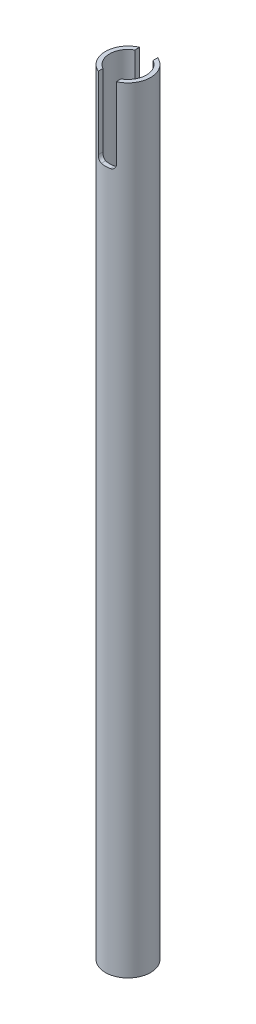
ISO-10303-21;
HEADER;
FILE_DESCRIPTION(('STEP AP214'),'2;1');
FILE_NAME('part.step','',(''),(''),'','','');
FILE_SCHEMA(('AUTOMOTIVE_DESIGN { 1 0 10303 214 1 1 1 1 }'));
ENDSEC;
DATA;
#1=APPLICATION_CONTEXT('core data for automotive mechanical design processes');
#2=APPLICATION_PROTOCOL_DEFINITION('international standard','automotive_design',2000,#1);
#3=PRODUCT_CONTEXT('',#1,'mechanical');
#4=PRODUCT('Part','Part','',(#3));
#5=PRODUCT_RELATED_PRODUCT_CATEGORY('part','',(#4));
#6=PRODUCT_DEFINITION_FORMATION('','',#4);
#7=PRODUCT_DEFINITION_CONTEXT('part definition',#1,'design');
#8=PRODUCT_DEFINITION('design','',#6,#7);
#9=PRODUCT_DEFINITION_SHAPE('','',#8);
#10=(LENGTH_UNIT() NAMED_UNIT(*) SI_UNIT(.MILLI.,.METRE.));
#11=(NAMED_UNIT(*) PLANE_ANGLE_UNIT() SI_UNIT($,.RADIAN.));
#12=(NAMED_UNIT(*) SI_UNIT($,.STERADIAN.) SOLID_ANGLE_UNIT());
#13=UNCERTAINTY_MEASURE_WITH_UNIT(LENGTH_MEASURE(1.E-05),#10,'distance_accuracy_value','');
#14=(GEOMETRIC_REPRESENTATION_CONTEXT(3) GLOBAL_UNCERTAINTY_ASSIGNED_CONTEXT((#13)) GLOBAL_UNIT_ASSIGNED_CONTEXT((#10,
#11,#12)) REPRESENTATION_CONTEXT('',''));
#15=CARTESIAN_POINT('',(0.,0.,0.));
#16=DIRECTION('',(0.,0.,1.));
#17=DIRECTION('',(1.,0.,0.));
#18=AXIS2_PLACEMENT_3D('',#15,#16,#17);
#19=CARTESIAN_POINT('',(4.7625,141.622450142195,0.));
#20=DIRECTION('',(0.,-1.,0.));
#21=DIRECTION('',(0.,0.,1.));
#22=AXIS2_PLACEMENT_3D('',#19,#20,#21);
#23=PLANE('',#22);
#24=DIRECTION('',(0.,0.,-1.));
#25=VECTOR('',#24,1.);
#26=CARTESIAN_POINT('',(3.17499999999998,141.622450142196,7.93750000000011));
#27=LINE('',#26,#25);
#28=CARTESIAN_POINT('',(3.17499999999998,141.622450142196,7.2748389157424));
#29=VERTEX_POINT('',#28);
#30=CARTESIAN_POINT('',(3.17499999999998,141.622450142196,5.63085690548074));
#31=VERTEX_POINT('',#30);
#32=EDGE_CURVE('E263',#29,#31,#27,.T.);
#33=ORIENTED_EDGE('',*,*,#32,.F.);
#34=CARTESIAN_POINT('',(0.,141.622450142195,0.));
#35=DIRECTION('',(0.,-1.,0.));
#36=DIRECTION('',(0.,0.,-1.));
#37=AXIS2_PLACEMENT_3D('',#34,#35,#36);
#38=CIRCLE('',#37,7.9375);
#39=CARTESIAN_POINT('',(3.17499999999998,141.622450142196,-7.2748389157424));
#40=VERTEX_POINT('',#39);
#41=EDGE_CURVE('E283',#40,#29,#38,.T.);
#42=ORIENTED_EDGE('',*,*,#41,.F.);
#43=CARTESIAN_POINT('',(3.17499999999998,141.622450142196,-5.63085690548074));
#44=VERTEX_POINT('',#43);
#45=EDGE_CURVE('E261',#44,#40,#27,.T.);
#46=ORIENTED_EDGE('',*,*,#45,.F.);
#47=CARTESIAN_POINT('',(0.,141.622450142195,0.));
#48=DIRECTION('',(0.,-1.,0.));
#49=DIRECTION('',(0.,0.,-1.));
#50=AXIS2_PLACEMENT_3D('',#47,#48,#49);
#51=CIRCLE('',#50,6.4643);
#52=EDGE_CURVE('E284',#44,#31,#51,.T.);
#53=ORIENTED_EDGE('',*,*,#52,.T.);
#54=EDGE_LOOP('',(#33,#42,#46,#53));
#55=FACE_BOUND('',#54,.T.);
#56=ADVANCED_FACE('F33',(#55),#23,.F.);
#57=DIRECTION('',(0.,0.,-1.));
#58=VECTOR('',#57,1.);
#59=CARTESIAN_POINT('',(-3.17499999999998,141.622450142196,7.93750000000011));
#60=LINE('',#59,#58);
#61=CARTESIAN_POINT('',(-3.17499999999998,141.622450142196,-5.63085690548088));
#62=VERTEX_POINT('',#61);
#63=CARTESIAN_POINT('',(-3.17499999999998,141.622450142196,-7.27483891574251));
#64=VERTEX_POINT('',#63);
#65=EDGE_CURVE('E257',#62,#64,#60,.T.);
#66=ORIENTED_EDGE('',*,*,#65,.T.);
#67=CARTESIAN_POINT('',(-3.17499999999998,141.622450142196,7.27483891574251));
#68=VERTEX_POINT('',#67);
#69=EDGE_CURVE('E278',#68,#64,#38,.T.);
#70=ORIENTED_EDGE('',*,*,#69,.F.);
#71=CARTESIAN_POINT('',(-3.17499999999998,141.622450142196,5.63085690548088));
#72=VERTEX_POINT('',#71);
#73=EDGE_CURVE('E260',#68,#72,#60,.T.);
#74=ORIENTED_EDGE('',*,*,#73,.T.);
#75=EDGE_CURVE('E285',#72,#62,#51,.T.);
#76=ORIENTED_EDGE('',*,*,#75,.T.);
#77=EDGE_LOOP('',(#66,#70,#74,#76));
#78=FACE_BOUND('',#77,.T.);
#79=ADVANCED_FACE('F190',(#78),#23,.F.);
#80=CARTESIAN_POINT('',(0.,25.4,0.));
#81=DIRECTION('',(0.,-1.,0.));
#82=DIRECTION('',(0.,0.,-1.));
#83=AXIS2_PLACEMENT_3D('',#80,#81,#82);
#84=CYLINDRICAL_SURFACE('',#83,6.4643);
#85=CARTESIAN_POINT('',(0.,-130.686769936123,1.09700443173821E-13));
#86=DIRECTION('',(0.,1.,0.));
#87=DIRECTION('',(0.,0.,1.));
#88=AXIS2_PLACEMENT_3D('',#85,#86,#87);
#89=CIRCLE('',#88,6.4643);
#90=CARTESIAN_POINT('',(0.,-130.686769936123,6.46430000000011));
#91=VERTEX_POINT('',#90);
#92=EDGE_CURVE('E272',#91,#91,#89,.T.);
#93=ORIENTED_EDGE('',*,*,#92,.F.);
#94=EDGE_LOOP('',(#93));
#95=FACE_BOUND('',#94,.T.);
#96=ORIENTED_EDGE('',*,*,#52,.F.);
#97=DIRECTION('',(0.,-1.,0.));
#98=VECTOR('',#97,1.);
#99=CARTESIAN_POINT('',(3.17500000000024,25.4,-5.63085690548059));
#100=LINE('',#99,#98);
#101=CARTESIAN_POINT('',(3.17500000000004,116.222450142196,-5.63085690548059));
#102=VERTEX_POINT('',#101);
#103=EDGE_CURVE('E180',#44,#102,#100,.T.);
#104=ORIENTED_EDGE('',*,*,#103,.T.);
#105=CARTESIAN_POINT('',(3.17500000000007,116.222450142196,-5.63085690548069));
#106=CARTESIAN_POINT('',(3.17500265942438,116.18129331152,-5.63085243150935));
#107=CARTESIAN_POINT('',(3.17339835018613,116.140158789346,-5.63176028239593));
#108=CARTESIAN_POINT('',(3.16701766507693,116.058232974005,-5.63535215701946));
#109=CARTESIAN_POINT('',(3.16224273305137,116.017441533164,-5.638035372285));
#110=CARTESIAN_POINT('',(3.143296645079,115.896446306391,-5.64863522411119));
#111=CARTESIAN_POINT('',(3.12450305374461,115.81713425395,-5.65910325483869));
#112=CARTESIAN_POINT('',(3.07549165040556,115.663384359452,-5.68588522764514));
#113=CARTESIAN_POINT('',(3.04528974537466,115.588939899132,-5.70219102829137));
#114=CARTESIAN_POINT('',(2.97460119282062,115.446272278136,-5.73938277272114));
#115=CARTESIAN_POINT('',(2.93410271969427,115.378056394245,-5.7602739790437));
#116=CARTESIAN_POINT('',(2.84103773378427,115.244778425985,-5.80676804025644));
#117=CARTESIAN_POINT('',(2.78784532739577,115.180232263922,-5.83259254506419));
#118=CARTESIAN_POINT('',(2.67254263369965,115.060665553884,-5.88631786935966));
#119=CARTESIAN_POINT('',(2.61042818908357,115.005649473051,-5.91421965383981));
#120=CARTESIAN_POINT('',(2.4714337140954,114.900632624744,-5.97373371686977));
#121=CARTESIAN_POINT('',(2.39368295701586,114.851822205188,-6.00542032126395));
#122=CARTESIAN_POINT('',(2.23068225215684,114.768194807137,-6.06785364975218));
#123=CARTESIAN_POINT('',(2.14543609512394,114.733370804165,-6.09860083846705));
#124=CARTESIAN_POINT('',(1.98216120584028,114.682773530532,-6.15341243852266));
#125=CARTESIAN_POINT('',(1.90486553835034,114.664976619597,-6.177801004364));
#126=CARTESIAN_POINT('',(1.74771289593301,114.641047451788,-6.224108887545));
#127=CARTESIAN_POINT('',(1.66785396509188,114.634924328704,-6.24602625877207));
#128=CARTESIAN_POINT('',(1.58750000000018,114.634950142196,-6.26634009929236));
#129=B_SPLINE_CURVE_WITH_KNOTS('',3,(#105,#106,#107,#108,#109,#110,#111,#112,#113,#114,#115,
#116,#117,#118,#119,#120,#121,#122,#123,#124,#125,#126,#127,#128),.UNSPECIFIED.,.F.,.F.,(4,2,2,
2,2,2,2,2,2,2,2,4),(0.,0.123386261727179,0.246716374037833,0.49193498010571,0.736812924701871,
0.981973392060187,1.24352761602781,1.50520411142382,1.79524970866356,2.08514945193381,
2.33322496948237,2.58149450643048),.UNSPECIFIED.);
#130=CARTESIAN_POINT('',(1.58750000000019,114.634950142196,-6.26634009929236));
#131=VERTEX_POINT('',#130);
#132=EDGE_CURVE('E173',#102,#131,#129,.T.);
#133=ORIENTED_EDGE('',*,*,#132,.T.);
#134=CARTESIAN_POINT('',(0.,114.634950142196,0.));
#135=DIRECTION('',(0.,1.,0.));
#136=DIRECTION('',(0.,0.,1.));
#137=AXIS2_PLACEMENT_3D('',#134,#135,#136);
#138=CIRCLE('',#137,6.4643);
#139=CARTESIAN_POINT('',(-1.58749999999991,114.634950142196,-6.26634009929243));
#140=VERTEX_POINT('',#139);
#141=EDGE_CURVE('E250',#131,#140,#138,.T.);
#142=ORIENTED_EDGE('',*,*,#141,.T.);
#143=CARTESIAN_POINT('',(-1.58749999999991,114.634950142196,-6.26634009929243));
#144=CARTESIAN_POINT('',(-1.6341890068027,114.634950363611,-6.25451519937796));
#145=CARTESIAN_POINT('',(-1.68071621150082,114.637010656151,-6.24216902424752));
#146=CARTESIAN_POINT('',(-1.77313930969805,114.645159067835,-6.21654599792509));
#147=CARTESIAN_POINT('',(-1.81903543834428,114.651245642802,-6.20326950527713));
#148=CARTESIAN_POINT('',(-1.95507469082064,114.67535656655,-6.1622868398915));
#149=CARTESIAN_POINT('',(-2.0438753420167,114.699233385489,-6.133349352247));
#150=CARTESIAN_POINT('',(-2.21532061503974,114.761518091836,-6.0735318101998));
#151=CARTESIAN_POINT('',(-2.29797173444347,114.799910373617,-6.04265387160466));
#152=CARTESIAN_POINT('',(-2.45546303738956,114.890145327512,-5.98038883139866));
#153=CARTESIAN_POINT('',(-2.53029702370288,114.941998559332,-5.94900134826915));
#154=CARTESIAN_POINT('',(-2.67287075398227,115.060122276205,-5.88635884745837));
#155=CARTESIAN_POINT('',(-2.74025626996517,115.126846161844,-5.85514963173662));
#156=CARTESIAN_POINT('',(-2.86271368076043,115.272183423216,-5.796263402366));
#157=CARTESIAN_POINT('',(-2.91778558227079,115.350796792481,-5.7685863867958));
#158=CARTESIAN_POINT('',(-3.01168872656624,115.515018726726,-5.72010524984435));
#159=CARTESIAN_POINT('',(-3.0510450221677,115.600261330066,-5.69908490291322));
#160=CARTESIAN_POINT('',(-3.1143037346524,115.777662124546,-5.66476886814874));
#161=CARTESIAN_POINT('',(-3.13824572360371,115.869801923889,-5.65145340907633));
#162=CARTESIAN_POINT('',(-3.16081362599342,116.006294931763,-5.63883740321029));
#163=CARTESIAN_POINT('',(-3.16612512648611,116.04930367883,-5.63585394797717));
#164=CARTESIAN_POINT('',(-3.17321828948626,116.135681719434,-5.6318620149314));
#165=CARTESIAN_POINT('',(-3.17500157254305,116.179050838253,-5.63085263040867));
#166=CARTESIAN_POINT('',(-3.17499999999996,116.222450142196,-5.63085690548075));
#167=B_SPLINE_CURVE_WITH_KNOTS('',3,(#143,#144,#145,#146,#147,#148,#149,#150,#151,#152,#153,
#154,#155,#156,#157,#158,#159,#160,#161,#162,#163,#164,#165,#166),.UNSPECIFIED.,.F.,.F.,(4,2,2,
2,2,2,2,2,2,2,2,4),(0.,0.144388740940304,0.288722137366161,0.57645212892239,0.863873656489916,
1.15152134248764,1.44956694911568,1.74761239362147,2.03464137858761,2.32093052452351,
2.45108160789042,2.58117289753282),.UNSPECIFIED.);
#168=CARTESIAN_POINT('',(-3.17499999999993,116.222450142196,-5.63085690548077));
#169=VERTEX_POINT('',#168);
#170=EDGE_CURVE('E195',#140,#169,#167,.T.);
#171=ORIENTED_EDGE('',*,*,#170,.T.);
#172=DIRECTION('',(0.,-1.,0.));
#173=VECTOR('',#172,1.);
#174=CARTESIAN_POINT('',(-3.17499999999973,25.4,-5.63085690548088));
#175=LINE('',#174,#173);
#176=EDGE_CURVE('E211',#169,#62,#175,.F.);
#177=ORIENTED_EDGE('',*,*,#176,.T.);
#178=ORIENTED_EDGE('',*,*,#75,.F.);
#179=DIRECTION('',(0.,-1.,0.));
#180=VECTOR('',#179,1.);
#181=CARTESIAN_POINT('',(-3.17499999999973,25.4,5.63085690548088));
#182=LINE('',#181,#180);
#183=CARTESIAN_POINT('',(-3.17499999999993,116.222450142196,5.63085690548077));
#184=VERTEX_POINT('',#183);
#185=EDGE_CURVE('E299',#72,#184,#182,.T.);
#186=ORIENTED_EDGE('',*,*,#185,.T.);
#187=CARTESIAN_POINT('',(-3.17499999999996,116.222450142196,5.63085690548075));
#188=CARTESIAN_POINT('',(-3.17500265942427,116.18129331152,5.63085243150942));
#189=CARTESIAN_POINT('',(-3.17339835018602,116.140158789346,5.63176028239599));
#190=CARTESIAN_POINT('',(-3.16701766507682,116.058232974005,5.63535215701953));
#191=CARTESIAN_POINT('',(-3.16224273305126,116.017441533164,5.63803537228507));
#192=CARTESIAN_POINT('',(-3.14329664507889,115.896446306391,5.64863522411125));
#193=CARTESIAN_POINT('',(-3.1245030537445,115.81713425395,5.65910325483875));
#194=CARTESIAN_POINT('',(-3.07549165040545,115.663384359452,5.6858852276452));
#195=CARTESIAN_POINT('',(-3.04528974537455,115.588939899132,5.70219102829143));
#196=CARTESIAN_POINT('',(-2.9746011928205,115.446272278136,5.7393827727212));
#197=CARTESIAN_POINT('',(-2.93410271969415,115.378056394245,5.76027397904376));
#198=CARTESIAN_POINT('',(-2.84103773378415,115.244778425985,5.80676804025649));
#199=CARTESIAN_POINT('',(-2.78784532739566,115.180232263922,5.83259254506425));
#200=CARTESIAN_POINT('',(-2.67254263369954,115.060665553884,5.88631786935971));
#201=CARTESIAN_POINT('',(-2.61042818908345,115.005649473051,5.91421965383986));
#202=CARTESIAN_POINT('',(-2.47143371409528,114.900632624744,5.97373371686981));
#203=CARTESIAN_POINT('',(-2.39368295701574,114.851822205188,6.00542032126399));
#204=CARTESIAN_POINT('',(-2.23068225215672,114.768194807137,6.06785364975222));
#205=CARTESIAN_POINT('',(-2.14543609512382,114.733370804165,6.09860083846709));
#206=CARTESIAN_POINT('',(-1.98216120584014,114.682773530532,6.15341243852271));
#207=CARTESIAN_POINT('',(-1.90486553835017,114.664976619597,6.17780100436405));
#208=CARTESIAN_POINT('',(-1.74771289593279,114.641047451788,6.22410888754506));
#209=CARTESIAN_POINT('',(-1.66785396509163,114.634924328704,6.24602625877214));
#210=CARTESIAN_POINT('',(-1.58749999999991,114.634950142196,6.26634009929243));
#211=B_SPLINE_CURVE_WITH_KNOTS('',3,(#187,#188,#189,#190,#191,#192,#193,#194,#195,#196,#197,
#198,#199,#200,#201,#202,#203,#204,#205,#206,#207,#208,#209,#210),.UNSPECIFIED.,.F.,.F.,(4,2,2,
2,2,2,2,2,2,2,2,4),(0.,0.123386261727179,0.246716374037833,0.49193498010571,0.73681292470187,
0.981973392060203,1.24352761602782,1.50520411142382,1.79524970866355,2.0851494519338,
2.33322496948244,2.58149450643064),.UNSPECIFIED.);
#212=CARTESIAN_POINT('',(-1.58749999999991,114.634950142196,6.26634009929243));
#213=VERTEX_POINT('',#212);
#214=EDGE_CURVE('E204',#184,#213,#211,.T.);
#215=ORIENTED_EDGE('',*,*,#214,.T.);
#216=CARTESIAN_POINT('',(1.58750000000019,114.634950142196,6.26634009929236));
#217=VERTEX_POINT('',#216);
#218=EDGE_CURVE('E265',#213,#217,#138,.T.);
#219=ORIENTED_EDGE('',*,*,#218,.T.);
#220=CARTESIAN_POINT('',(1.58750000000019,114.634950142196,6.26634009929236));
#221=CARTESIAN_POINT('',(1.63418900680297,114.634950363611,6.25451519937789));
#222=CARTESIAN_POINT('',(1.6807162115011,114.637010656151,6.24216902424745));
#223=CARTESIAN_POINT('',(1.77313930969832,114.645159067835,6.21654599792501));
#224=CARTESIAN_POINT('',(1.81903543834456,114.651245642802,6.20326950527705));
#225=CARTESIAN_POINT('',(1.95507469082092,114.67535656655,6.16228683989141));
#226=CARTESIAN_POINT('',(2.04387534201697,114.699233385489,6.13334935224691));
#227=CARTESIAN_POINT('',(2.21532061504001,114.761518091836,6.0735318101997));
#228=CARTESIAN_POINT('',(2.29797173444374,114.799910373617,6.04265387160456));
#229=CARTESIAN_POINT('',(2.45546303738983,114.890145327512,5.98038883139855));
#230=CARTESIAN_POINT('',(2.53029702370314,114.941998559332,5.94900134826904));
#231=CARTESIAN_POINT('',(2.67287075398251,115.060122276205,5.88635884745826));
#232=CARTESIAN_POINT('',(2.7402562699654,115.126846161844,5.85514963173651));
#233=CARTESIAN_POINT('',(2.86271368076065,115.272183423216,5.79626340236589));
#234=CARTESIAN_POINT('',(2.917785582271,115.350796792481,5.76858638679569));
#235=CARTESIAN_POINT('',(3.01168872656643,115.515018726727,5.72010524984425));
#236=CARTESIAN_POINT('',(3.05104502216788,115.600261330067,5.69908490291312));
#237=CARTESIAN_POINT('',(3.11430373465256,115.777662124546,5.66476886814865));
#238=CARTESIAN_POINT('',(3.13824572360386,115.869801923889,5.65145340907624));
#239=CARTESIAN_POINT('',(3.16081362599355,116.006294931764,5.63883740321022));
#240=CARTESIAN_POINT('',(3.16612512648623,116.04930367883,5.6358539479771));
#241=CARTESIAN_POINT('',(3.17321828948637,116.135681719434,5.63186201493133));
#242=CARTESIAN_POINT('',(3.17500157254316,116.179050838253,5.63085263040861));
#243=CARTESIAN_POINT('',(3.17500000000007,116.222450142196,5.63085690548069));
#244=B_SPLINE_CURVE_WITH_KNOTS('',3,(#220,#221,#222,#223,#224,#225,#226,#227,#228,#229,#230,
#231,#232,#233,#234,#235,#236,#237,#238,#239,#240,#241,#242,#243),.UNSPECIFIED.,.F.,.F.,(4,2,2,
2,2,2,2,2,2,2,2,4),(0.,0.144388740940308,0.288722137366167,0.576452128922401,0.863873656489942,
1.15152134248767,1.4495669491157,1.7476123936215,2.03464137858764,2.32093052452353,
2.45108160789035,2.58117289753265),.UNSPECIFIED.);
#245=CARTESIAN_POINT('',(3.17500000000004,116.222450142196,5.63085690548059));
#246=VERTEX_POINT('',#245);
#247=EDGE_CURVE('E139',#217,#246,#244,.T.);
#248=ORIENTED_EDGE('',*,*,#247,.T.);
#249=DIRECTION('',(0.,-1.,0.));
#250=VECTOR('',#249,1.);
#251=CARTESIAN_POINT('',(3.17500000000024,25.4,5.63085690548059));
#252=LINE('',#251,#250);
#253=EDGE_CURVE('E270',#246,#31,#252,.F.);
#254=ORIENTED_EDGE('',*,*,#253,.T.);
#255=EDGE_LOOP('',(#96,#104,#133,#142,#171,#177,#178,#186,#215,#219,#248,#254));
#256=FACE_BOUND('',#255,.T.);
#257=ADVANCED_FACE('F187',(#95,#256),#84,.F.);
#258=CARTESIAN_POINT('',(0.,25.4,0.));
#259=DIRECTION('',(0.,-1.,0.));
#260=DIRECTION('',(0.,0.,-1.));
#261=AXIS2_PLACEMENT_3D('',#258,#259,#260);
#262=CYLINDRICAL_SURFACE('',#261,7.9375);
#263=CARTESIAN_POINT('',(0.,-130.686769936123,1.09700443173821E-13));
#264=DIRECTION('',(0.,1.,0.));
#265=DIRECTION('',(0.,0.,1.));
#266=AXIS2_PLACEMENT_3D('',#263,#264,#265);
#267=CIRCLE('',#266,7.9375);
#268=CARTESIAN_POINT('',(0.,-130.686769936123,7.93750000000011));
#269=VERTEX_POINT('',#268);
#270=EDGE_CURVE('E274',#269,#269,#267,.T.);
#271=ORIENTED_EDGE('',*,*,#270,.T.);
#272=EDGE_LOOP('',(#271));
#273=FACE_BOUND('',#272,.T.);
#274=DIRECTION('',(0.,-1.,0.));
#275=VECTOR('',#274,1.);
#276=CARTESIAN_POINT('',(3.17500000000024,25.4,7.27483891574229));
#277=LINE('',#276,#275);
#278=CARTESIAN_POINT('',(3.17500000000004,116.222450142196,7.27483891574229));
#279=VERTEX_POINT('',#278);
#280=EDGE_CURVE('E12',#279,#29,#277,.F.);
#281=ORIENTED_EDGE('',*,*,#280,.F.);
#282=CARTESIAN_POINT('',(1.58750000000019,114.634950142196,7.77712993333655));
#283=CARTESIAN_POINT('',(1.63350676862791,114.634950385786,7.76774126330061));
#284=CARTESIAN_POINT('',(1.67940359564195,114.636951046903,7.75794444810857));
#285=CARTESIAN_POINT('',(1.7706803958093,114.644888410221,7.7376208999197));
#286=CARTESIAN_POINT('',(1.81606050148723,114.65082407897,7.72709435922083));
#287=CARTESIAN_POINT('',(1.95078228156852,114.674397028221,7.69459845201105));
#288=CARTESIAN_POINT('',(2.03894812030842,114.697800975143,7.67166299368624));
#289=CARTESIAN_POINT('',(2.20953807004396,114.759081172315,7.62428385726788));
#290=CARTESIAN_POINT('',(2.29196515383534,114.796949862574,7.59984097261632));
#291=CARTESIAN_POINT('',(2.44917385980124,114.886097132616,7.550645021841));
#292=CARTESIAN_POINT('',(2.52395227814518,114.937381300061,7.52589183057158));
#293=CARTESIAN_POINT('',(2.66543932718712,115.053368348016,7.47696931777056));
#294=CARTESIAN_POINT('',(2.7319388349313,115.118337073132,7.45282414598353));
#295=CARTESIAN_POINT('',(2.85299322074877,115.259475286965,7.40732925012115));
#296=CARTESIAN_POINT('',(2.90754767783208,115.335645170297,7.38597962458236));
#297=CARTESIAN_POINT('',(3.00159155783969,115.49521887078,7.34825600672409));
#298=CARTESIAN_POINT('',(3.04142452291165,115.578393326041,7.33177064627849));
#299=CARTESIAN_POINT('',(3.10622330269338,115.751163958141,7.30455577634138));
#300=CARTESIAN_POINT('',(3.13121458917055,115.84074883531,7.29381640854945));
#301=CARTESIAN_POINT('',(3.15710194076309,115.979796655077,7.28263004031738));
#302=CARTESIAN_POINT('',(3.16380495831036,116.028051881918,7.27971714426161));
#303=CARTESIAN_POINT('',(3.17275416759991,116.125011300347,7.27581937849737));
#304=CARTESIAN_POINT('',(3.17500392571323,116.173715101265,7.27483296598244));
#305=CARTESIAN_POINT('',(3.17500000000007,116.222450142196,7.27483891574237));
#306=B_SPLINE_CURVE_WITH_KNOTS('',3,(#282,#283,#284,#285,#286,#287,#288,#289,#290,#291,#292,
#293,#294,#295,#296,#297,#298,#299,#300,#301,#302,#303,#304,#305),.UNSPECIFIED.,.F.,.F.,(4,2,2,
2,2,2,2,2,2,2,2,4),(0.,0.140770845296611,0.281504734514017,0.562238948643056,0.842826637517807,
1.1235313801953,1.41029752992667,1.69707378478456,1.97665708187313,2.25575915194307,
2.40195937855941,2.54804247399287),.UNSPECIFIED.);
#307=CARTESIAN_POINT('',(1.58750000000019,114.634950142196,7.77712993333655));
#308=VERTEX_POINT('',#307);
#309=EDGE_CURVE('E42',#308,#279,#306,.T.);
#310=ORIENTED_EDGE('',*,*,#309,.F.);
#311=CARTESIAN_POINT('',(0.,114.634950142196,0.));
#312=DIRECTION('',(0.,1.,0.));
#313=DIRECTION('',(0.,0.,1.));
#314=AXIS2_PLACEMENT_3D('',#311,#312,#313);
#315=CIRCLE('',#314,7.9375);
#316=CARTESIAN_POINT('',(-1.58749999999991,114.634950142196,7.77712993333661));
#317=VERTEX_POINT('',#316);
#318=EDGE_CURVE('E122',#317,#308,#315,.T.);
#319=ORIENTED_EDGE('',*,*,#318,.F.);
#320=CARTESIAN_POINT('',(-3.17499999999996,116.222450142196,7.27483891574242));
#321=CARTESIAN_POINT('',(-3.17500168113654,116.180078590213,7.274835863661));
#322=CARTESIAN_POINT('',(-3.17330245165564,116.13772889455,7.27558001702577));
#323=CARTESIAN_POINT('',(-3.16653661877874,116.05336308008,7.27852818539401));
#324=CARTESIAN_POINT('',(-3.16147102917754,116.011346864699,7.28073176088513));
#325=CARTESIAN_POINT('',(-3.14133450163405,115.886564506684,7.28945465778903));
#326=CARTESIAN_POINT('',(-3.1213230875001,115.804684187594,7.29808678684579));
#327=CARTESIAN_POINT('',(-3.06894040253668,115.645826299594,7.320266846251));
#328=CARTESIAN_POINT('',(-3.03657783085923,115.568845324406,7.33381131641252));
#329=CARTESIAN_POINT('',(-2.9606123462771,115.421452744031,7.36480545430107));
#330=CARTESIAN_POINT('',(-2.91700139314274,115.35104588719,7.38225791423854));
#331=CARTESIAN_POINT('',(-2.81767453343909,115.215371598322,7.42075264717219));
#332=CARTESIAN_POINT('',(-2.76150754869694,115.150470588559,7.44191980144861));
#333=CARTESIAN_POINT('',(-2.63982081610497,115.030785064854,7.48594933347429));
#334=CARTESIAN_POINT('',(-2.57429738653614,114.976004552837,7.50881237683836));
#335=CARTESIAN_POINT('',(-2.43069507728345,114.874327165765,7.55656843444932));
#336=CARTESIAN_POINT('',(-2.35206470826196,114.82822263679,7.58149355937881));
#337=CARTESIAN_POINT('',(-2.18789362747871,114.750057032591,7.63048866953839));
#338=CARTESIAN_POINT('',(-2.10235659094253,114.717988545984,7.65455909988384));
#339=CARTESIAN_POINT('',(-1.94541809174962,114.674163551211,7.69573507431981));
#340=CARTESIAN_POINT('',(-1.87491037842439,114.659528446365,7.71322855066074));
#341=CARTESIAN_POINT('',(-1.7321911340128,114.639912684511,7.74654000063459));
#342=CARTESIAN_POINT('',(-1.65997981118735,114.634930853548,7.7623581777831));
#343=CARTESIAN_POINT('',(-1.58749999999991,114.634950142196,7.77712993333661));
#344=B_SPLINE_CURVE_WITH_KNOTS('',3,(#320,#321,#322,#323,#324,#325,#326,#327,#328,#329,#330,
#331,#332,#333,#334,#335,#336,#337,#338,#339,#340,#341,#342,#343),.UNSPECIFIED.,.F.,.F.,(4,2,2,
2,2,2,2,2,2,2,2,4),(0.,0.127031494291929,0.254024749792407,0.506885265042648,0.759568013575113,
1.01243188015949,1.27651034681332,1.54069301498301,1.82289095795807,2.10493971303596,
2.32661111398106,2.54825555529039),.UNSPECIFIED.);
#345=CARTESIAN_POINT('',(-3.17499999999993,116.222450142196,7.27483891574243));
#346=VERTEX_POINT('',#345);
#347=EDGE_CURVE('E130',#346,#317,#344,.T.);
#348=ORIENTED_EDGE('',*,*,#347,.F.);
#349=DIRECTION('',(0.,-1.,0.));
#350=VECTOR('',#349,1.);
#351=CARTESIAN_POINT('',(-3.17499999999973,25.4,7.27483891574251));
#352=LINE('',#351,#350);
#353=EDGE_CURVE('E235',#68,#346,#352,.T.);
#354=ORIENTED_EDGE('',*,*,#353,.F.);
#355=ORIENTED_EDGE('',*,*,#69,.T.);
#356=DIRECTION('',(0.,-1.,0.));
#357=VECTOR('',#356,1.);
#358=CARTESIAN_POINT('',(-3.17499999999973,25.4,-7.27483891574251));
#359=LINE('',#358,#357);
#360=CARTESIAN_POINT('',(-3.17499999999993,116.222450142196,-7.27483891574243));
#361=VERTEX_POINT('',#360);
#362=EDGE_CURVE('E131',#361,#64,#359,.F.);
#363=ORIENTED_EDGE('',*,*,#362,.F.);
#364=CARTESIAN_POINT('',(-1.58749999999991,114.634950142196,-7.77712993333661));
#365=CARTESIAN_POINT('',(-1.63350676862763,114.634950385786,-7.76774126330067));
#366=CARTESIAN_POINT('',(-1.67940359564167,114.636951046903,-7.75794444810863));
#367=CARTESIAN_POINT('',(-1.77068039580902,114.644888410221,-7.73762089991976));
#368=CARTESIAN_POINT('',(-1.81606050148696,114.65082407897,-7.7270943592209));
#369=CARTESIAN_POINT('',(-1.95078228156824,114.674397028221,-7.69459845201112));
#370=CARTESIAN_POINT('',(-2.03894812030814,114.697800975143,-7.67166299368632));
#371=CARTESIAN_POINT('',(-2.20953807004368,114.759081172315,-7.62428385726796));
#372=CARTESIAN_POINT('',(-2.29196515383508,114.796949862574,-7.5998409726164));
#373=CARTESIAN_POINT('',(-2.44917385980098,114.886097132616,-7.55064502184109));
#374=CARTESIAN_POINT('',(-2.52395227814492,114.937381300061,-7.52589183057167));
#375=CARTESIAN_POINT('',(-2.66543932718688,115.053368348016,-7.47696931777064));
#376=CARTESIAN_POINT('',(-2.73193883493107,115.118337073132,-7.45282414598362));
#377=CARTESIAN_POINT('',(-2.85299322074856,115.259475286965,-7.40732925012124));
#378=CARTESIAN_POINT('',(-2.90754767783187,115.335645170296,-7.38597962458245));
#379=CARTESIAN_POINT('',(-3.0015915578395,115.49521887078,-7.34825600672417));
#380=CARTESIAN_POINT('',(-3.04142452291147,115.57839332604,-7.33177064627857));
#381=CARTESIAN_POINT('',(-3.10622330269321,115.751163958141,-7.30455577634145));
#382=CARTESIAN_POINT('',(-3.1312145891704,115.84074883531,-7.29381640854952));
#383=CARTESIAN_POINT('',(-3.15710194076296,115.979796655077,-7.28263004031743));
#384=CARTESIAN_POINT('',(-3.16380495831024,116.028051881918,-7.27971714426166));
#385=CARTESIAN_POINT('',(-3.1727541675998,116.125011300347,-7.27581937849742));
#386=CARTESIAN_POINT('',(-3.17500392571312,116.173715101265,-7.27483296598249));
#387=CARTESIAN_POINT('',(-3.17499999999996,116.222450142196,-7.27483891574242));
#388=B_SPLINE_CURVE_WITH_KNOTS('',3,(#364,#365,#366,#367,#368,#369,#370,#371,#372,#373,#374,
#375,#376,#377,#378,#379,#380,#381,#382,#383,#384,#385,#386,#387),.UNSPECIFIED.,.F.,.F.,(4,2,2,
2,2,2,2,2,2,2,2,4),(0.,0.140770845296607,0.281504734514012,0.562238948643044,0.842826637517792,
1.12353138019527,1.41029752992666,1.69707378478452,1.97665708187311,2.25575915194305,
2.40195937855949,2.54804247399305),.UNSPECIFIED.);
#389=CARTESIAN_POINT('',(-1.58749999999991,114.634950142196,-7.77712993333661));
#390=VERTEX_POINT('',#389);
#391=EDGE_CURVE('E223',#390,#361,#388,.T.);
#392=ORIENTED_EDGE('',*,*,#391,.F.);
#393=CARTESIAN_POINT('',(1.58750000000019,114.634950142196,-7.77712993333655));
#394=VERTEX_POINT('',#393);
#395=EDGE_CURVE('E133',#394,#390,#315,.T.);
#396=ORIENTED_EDGE('',*,*,#395,.F.);
#397=CARTESIAN_POINT('',(3.17500000000007,116.222450142196,-7.27483891574237));
#398=CARTESIAN_POINT('',(3.17500168113665,116.180078590213,-7.27483586366095));
#399=CARTESIAN_POINT('',(3.17330245165575,116.13772889455,-7.27558001702572));
#400=CARTESIAN_POINT('',(3.16653661877885,116.05336308008,-7.27852818539396));
#401=CARTESIAN_POINT('',(3.16147102917766,116.011346864699,-7.28073176088508));
#402=CARTESIAN_POINT('',(3.14133450163416,115.886564506684,-7.28945465778898));
#403=CARTESIAN_POINT('',(3.12132308750021,115.804684187594,-7.29808678684574));
#404=CARTESIAN_POINT('',(3.06894040253679,115.645826299594,-7.32026684625095));
#405=CARTESIAN_POINT('',(3.03657783085934,115.568845324406,-7.33381131641247));
#406=CARTESIAN_POINT('',(2.96061234627722,115.421452744031,-7.36480545430103));
#407=CARTESIAN_POINT('',(2.91700139314285,115.35104588719,-7.3822579142385));
#408=CARTESIAN_POINT('',(2.81767453343921,115.215371598322,-7.42075264717214));
#409=CARTESIAN_POINT('',(2.76150754869707,115.150470588559,-7.44191980144856));
#410=CARTESIAN_POINT('',(2.6398208161051,115.030785064854,-7.48594933347424));
#411=CARTESIAN_POINT('',(2.57429738653627,114.976004552837,-7.50881237683832));
#412=CARTESIAN_POINT('',(2.43069507728359,114.874327165765,-7.55656843444928));
#413=CARTESIAN_POINT('',(2.3520647082621,114.82822263679,-7.58149355937877));
#414=CARTESIAN_POINT('',(2.18789362747884,114.750057032591,-7.63048866953835));
#415=CARTESIAN_POINT('',(2.10235659094267,114.717988545984,-7.65455909988381));
#416=CARTESIAN_POINT('',(1.94541809174978,114.674163551211,-7.69573507431977));
#417=CARTESIAN_POINT('',(1.87491037842457,114.659528446365,-7.71322855066069));
#418=CARTESIAN_POINT('',(1.73219113401303,114.639912684511,-7.74654000063454));
#419=CARTESIAN_POINT('',(1.6599798111876,114.634930853548,-7.76235817778305));
#420=CARTESIAN_POINT('',(1.58750000000019,114.634950142196,-7.77712993333655));
#421=B_SPLINE_CURVE_WITH_KNOTS('',3,(#397,#398,#399,#400,#401,#402,#403,#404,#405,#406,#407,
#408,#409,#410,#411,#412,#413,#414,#415,#416,#417,#418,#419,#420),.UNSPECIFIED.,.F.,.F.,(4,2,2,
2,2,2,2,2,2,2,2,4),(0.,0.127031494291929,0.254024749792393,0.506885265042633,0.759568013575114,
1.01243188015947,1.27651034681329,1.54069301498299,1.82289095795804,2.10493971303593,
2.32661111398096,2.54825555529023),.UNSPECIFIED.);
#422=CARTESIAN_POINT('',(3.17500000000004,116.222450142196,-7.27483891574229));
#423=VERTEX_POINT('',#422);
#424=EDGE_CURVE('E145',#423,#394,#421,.T.);
#425=ORIENTED_EDGE('',*,*,#424,.F.);
#426=DIRECTION('',(0.,-1.,0.));
#427=VECTOR('',#426,1.);
#428=CARTESIAN_POINT('',(3.17500000000024,25.4,-7.27483891574229));
#429=LINE('',#428,#427);
#430=EDGE_CURVE('E57',#40,#423,#429,.T.);
#431=ORIENTED_EDGE('',*,*,#430,.F.);
#432=ORIENTED_EDGE('',*,*,#41,.T.);
#433=EDGE_LOOP('',(#281,#310,#319,#348,#354,#355,#363,#392,#396,#425,#431,#432));
#434=FACE_BOUND('',#433,.T.);
#435=ADVANCED_FACE('F35',(#273,#434),#262,.T.);
#436=CARTESIAN_POINT('',(0.,-130.686769936123,1.09700443173821E-13));
#437=DIRECTION('',(0.,1.,0.));
#438=DIRECTION('',(0.,0.,1.));
#439=AXIS2_PLACEMENT_3D('',#436,#437,#438);
#440=PLANE('',#439);
#441=ORIENTED_EDGE('',*,*,#92,.T.);
#442=EDGE_LOOP('',(#441));
#443=FACE_BOUND('',#442,.T.);
#444=ORIENTED_EDGE('',*,*,#270,.F.);
#445=EDGE_LOOP('',(#444));
#446=FACE_BOUND('',#445,.T.);
#447=ADVANCED_FACE('F161',(#443,#446),#440,.F.);
#448=CARTESIAN_POINT('',(3.17499999999998,141.622450142196,7.93750000000011));
#449=DIRECTION('',(-1.,0.,0.));
#450=DIRECTION('',(0.,-1.,0.));
#451=AXIS2_PLACEMENT_3D('',#448,#449,#450);
#452=PLANE('',#451);
#453=DIRECTION('',(0.,0.,-1.));
#454=VECTOR('',#453,1.);
#455=CARTESIAN_POINT('',(3.17500000000004,116.222450142196,7.93750000000011));
#456=LINE('',#455,#454);
#457=EDGE_CURVE('E264',#279,#246,#456,.T.);
#458=ORIENTED_EDGE('',*,*,#457,.F.);
#459=ORIENTED_EDGE('',*,*,#280,.T.);
#460=ORIENTED_EDGE('',*,*,#32,.T.);
#461=ORIENTED_EDGE('',*,*,#253,.F.);
#462=EDGE_LOOP('',(#458,#459,#460,#461));
#463=FACE_BOUND('',#462,.T.);
#464=ADVANCED_FACE('F306',(#463),#452,.T.);
#465=CARTESIAN_POINT('',(1.58750000000019,114.634950142196,7.93750000000011));
#466=DIRECTION('',(0.,1.,0.));
#467=DIRECTION('',(0.,0.,1.));
#468=AXIS2_PLACEMENT_3D('',#465,#466,#467);
#469=PLANE('',#468);
#470=DIRECTION('',(0.,0.,-1.));
#471=VECTOR('',#470,1.);
#472=CARTESIAN_POINT('',(-1.58749999999991,114.634950142196,7.93750000000011));
#473=LINE('',#472,#471);
#474=EDGE_CURVE('E49',#317,#213,#473,.T.);
#475=ORIENTED_EDGE('',*,*,#474,.F.);
#476=ORIENTED_EDGE('',*,*,#318,.T.);
#477=DIRECTION('',(0.,0.,-1.));
#478=VECTOR('',#477,1.);
#479=CARTESIAN_POINT('',(1.58750000000019,114.634950142196,7.93750000000011));
#480=LINE('',#479,#478);
#481=EDGE_CURVE('E125',#308,#217,#480,.T.);
#482=ORIENTED_EDGE('',*,*,#481,.T.);
#483=ORIENTED_EDGE('',*,*,#218,.F.);
#484=EDGE_LOOP('',(#475,#476,#482,#483));
#485=FACE_BOUND('',#484,.T.);
#486=ADVANCED_FACE('F124',(#485),#469,.T.);
#487=CARTESIAN_POINT('',(-1.58749999999991,116.222450142196,7.93750000000011));
#488=DIRECTION('',(0.,0.,-1.));
#489=DIRECTION('',(0.,1.,0.));
#490=AXIS2_PLACEMENT_3D('',#487,#488,#489);
#491=CYLINDRICAL_SURFACE('',#490,1.58750000000005);
#492=DIRECTION('',(0.,0.,-1.));
#493=VECTOR('',#492,1.);
#494=CARTESIAN_POINT('',(-3.17499999999993,116.222450142196,7.93750000000011));
#495=LINE('',#494,#493);
#496=EDGE_CURVE('E256',#346,#184,#495,.T.);
#497=ORIENTED_EDGE('',*,*,#496,.F.);
#498=ORIENTED_EDGE('',*,*,#347,.T.);
#499=ORIENTED_EDGE('',*,*,#474,.T.);
#500=ORIENTED_EDGE('',*,*,#214,.F.);
#501=EDGE_LOOP('',(#497,#498,#499,#500));
#502=FACE_BOUND('',#501,.T.);
#503=ADVANCED_FACE('F213',(#502),#491,.F.);
#504=CARTESIAN_POINT('',(-3.17499999999993,116.222450142196,7.93750000000011));
#505=DIRECTION('',(1.,0.,0.));
#506=DIRECTION('',(0.,1.,0.));
#507=AXIS2_PLACEMENT_3D('',#504,#505,#506);
#508=PLANE('',#507);
#509=ORIENTED_EDGE('',*,*,#73,.F.);
#510=ORIENTED_EDGE('',*,*,#353,.T.);
#511=ORIENTED_EDGE('',*,*,#496,.T.);
#512=ORIENTED_EDGE('',*,*,#185,.F.);
#513=EDGE_LOOP('',(#509,#510,#511,#512));
#514=FACE_BOUND('',#513,.T.);
#515=ADVANCED_FACE('F158',(#514),#508,.T.);
#516=CARTESIAN_POINT('',(1.58750000000002,116.222450142196,7.93750000000011));
#517=DIRECTION('',(0.,0.,-1.));
#518=DIRECTION('',(0.,1.,0.));
#519=AXIS2_PLACEMENT_3D('',#516,#517,#518);
#520=CYLINDRICAL_SURFACE('',#519,1.58750000000005);
#521=ORIENTED_EDGE('',*,*,#481,.F.);
#522=ORIENTED_EDGE('',*,*,#309,.T.);
#523=ORIENTED_EDGE('',*,*,#457,.T.);
#524=ORIENTED_EDGE('',*,*,#247,.F.);
#525=EDGE_LOOP('',(#521,#522,#523,#524));
#526=FACE_BOUND('',#525,.T.);
#527=ADVANCED_FACE('F135',(#526),#520,.F.);
#528=EDGE_CURVE('E245',#102,#423,#456,.T.);
#529=ORIENTED_EDGE('',*,*,#528,.T.);
#530=ORIENTED_EDGE('',*,*,#424,.T.);
#531=EDGE_CURVE('E141',#131,#394,#480,.T.);
#532=ORIENTED_EDGE('',*,*,#531,.F.);
#533=ORIENTED_EDGE('',*,*,#132,.F.);
#534=EDGE_LOOP('',(#529,#530,#532,#533));
#535=FACE_BOUND('',#534,.T.);
#536=ADVANCED_FACE('F157',(#535),#520,.F.);
#537=ORIENTED_EDGE('',*,*,#45,.T.);
#538=ORIENTED_EDGE('',*,*,#430,.T.);
#539=ORIENTED_EDGE('',*,*,#528,.F.);
#540=ORIENTED_EDGE('',*,*,#103,.F.);
#541=EDGE_LOOP('',(#537,#538,#539,#540));
#542=FACE_BOUND('',#541,.T.);
#543=ADVANCED_FACE('F159',(#542),#452,.T.);
#544=EDGE_CURVE('E253',#169,#361,#495,.T.);
#545=ORIENTED_EDGE('',*,*,#544,.T.);
#546=ORIENTED_EDGE('',*,*,#362,.T.);
#547=ORIENTED_EDGE('',*,*,#65,.F.);
#548=ORIENTED_EDGE('',*,*,#176,.F.);
#549=EDGE_LOOP('',(#545,#546,#547,#548));
#550=FACE_BOUND('',#549,.T.);
#551=ADVANCED_FACE('F291',(#550),#508,.T.);
#552=EDGE_CURVE('E140',#140,#390,#473,.T.);
#553=ORIENTED_EDGE('',*,*,#552,.T.);
#554=ORIENTED_EDGE('',*,*,#391,.T.);
#555=ORIENTED_EDGE('',*,*,#544,.F.);
#556=ORIENTED_EDGE('',*,*,#170,.F.);
#557=EDGE_LOOP('',(#553,#554,#555,#556));
#558=FACE_BOUND('',#557,.T.);
#559=ADVANCED_FACE('F218',(#558),#491,.F.);
#560=ORIENTED_EDGE('',*,*,#531,.T.);
#561=ORIENTED_EDGE('',*,*,#395,.T.);
#562=ORIENTED_EDGE('',*,*,#552,.F.);
#563=ORIENTED_EDGE('',*,*,#141,.F.);
#564=EDGE_LOOP('',(#560,#561,#562,#563));
#565=FACE_BOUND('',#564,.T.);
#566=ADVANCED_FACE('F219',(#565),#469,.T.);
#567=CLOSED_SHELL('',(#56,#79,#257,#435,#447,#464,#486,#503,#515,#527,#536,#543,#551,#559,#566));
#568=MANIFOLD_SOLID_BREP('B2',#567);
#569=ADVANCED_BREP_SHAPE_REPRESENTATION('',(#18,#568),#14);
#570=SHAPE_DEFINITION_REPRESENTATION(#9,#569);
ENDSEC;
END-ISO-10303-21;
